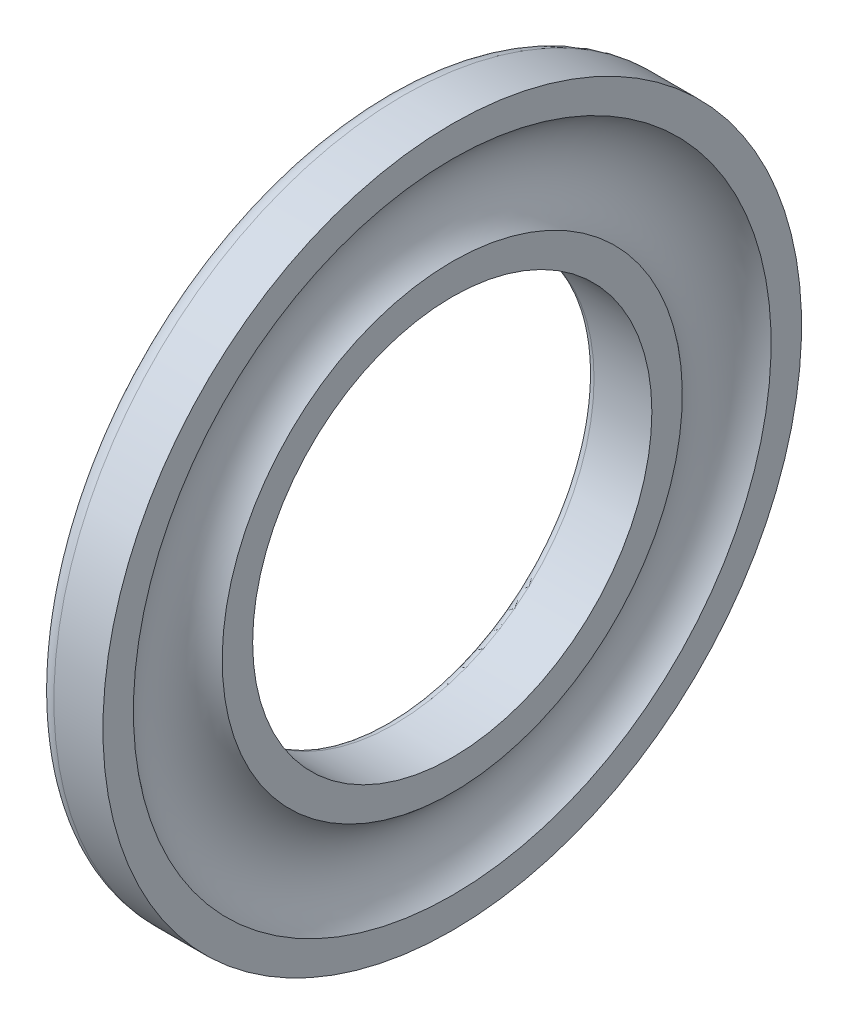
ISO-10303-21;
HEADER;
FILE_DESCRIPTION(('STEP AP214'),'2;1');
FILE_NAME('part.step','',(''),(''),'','','');
FILE_SCHEMA(('AUTOMOTIVE_DESIGN { 1 0 10303 214 1 1 1 1 }'));
ENDSEC;
DATA;
#1=APPLICATION_CONTEXT('core data for automotive mechanical design processes');
#2=APPLICATION_PROTOCOL_DEFINITION('international standard','automotive_design',2000,#1);
#3=PRODUCT_CONTEXT('',#1,'mechanical');
#4=PRODUCT('Part','Part','',(#3));
#5=PRODUCT_RELATED_PRODUCT_CATEGORY('part','',(#4));
#6=PRODUCT_DEFINITION_FORMATION('','',#4);
#7=PRODUCT_DEFINITION_CONTEXT('part definition',#1,'design');
#8=PRODUCT_DEFINITION('design','',#6,#7);
#9=PRODUCT_DEFINITION_SHAPE('','',#8);
#10=(LENGTH_UNIT() NAMED_UNIT(*) SI_UNIT(.MILLI.,.METRE.));
#11=(NAMED_UNIT(*) PLANE_ANGLE_UNIT() SI_UNIT($,.RADIAN.));
#12=(NAMED_UNIT(*) SI_UNIT($,.STERADIAN.) SOLID_ANGLE_UNIT());
#13=UNCERTAINTY_MEASURE_WITH_UNIT(LENGTH_MEASURE(1.E-05),#10,'distance_accuracy_value','');
#14=(GEOMETRIC_REPRESENTATION_CONTEXT(3) GLOBAL_UNCERTAINTY_ASSIGNED_CONTEXT((#13)) GLOBAL_UNIT_ASSIGNED_CONTEXT((#10,
#11,#12)) REPRESENTATION_CONTEXT('',''));
#15=CARTESIAN_POINT('',(0.,0.,0.));
#16=DIRECTION('',(0.,0.,1.));
#17=DIRECTION('',(1.,0.,0.));
#18=AXIS2_PLACEMENT_3D('',#15,#16,#17);
#19=CARTESIAN_POINT('',(0.875,0.,0.));
#20=DIRECTION('',(1.,0.,0.));
#21=DIRECTION('',(0.,0.,1.));
#22=AXIS2_PLACEMENT_3D('',#19,#20,#21);
#23=TOROIDAL_SURFACE('',#22,16.625,0.875);
#24=CARTESIAN_POINT('',(0.,0.,0.));
#25=DIRECTION('',(1.,0.,0.));
#26=DIRECTION('',(0.,1.,0.));
#27=AXIS2_PLACEMENT_3D('',#24,#25,#26);
#28=CIRCLE('',#27,16.625);
#29=CARTESIAN_POINT('',(0.,16.625,0.));
#30=VERTEX_POINT('',#29);
#31=EDGE_CURVE('E11',#30,#30,#28,.T.);
#32=ORIENTED_EDGE('',*,*,#31,.T.);
#33=EDGE_LOOP('',(#32));
#34=FACE_BOUND('',#33,.T.);
#35=CARTESIAN_POINT('',(0.875,0.,0.));
#36=DIRECTION('',(1.,0.,0.));
#37=DIRECTION('',(0.,1.,0.));
#38=AXIS2_PLACEMENT_3D('',#35,#36,#37);
#39=CIRCLE('',#38,17.5);
#40=CARTESIAN_POINT('',(0.875,17.5,0.));
#41=VERTEX_POINT('',#40);
#42=EDGE_CURVE('E57',#41,#41,#39,.T.);
#43=ORIENTED_EDGE('',*,*,#42,.F.);
#44=EDGE_LOOP('',(#43));
#45=FACE_BOUND('',#44,.T.);
#46=ADVANCED_FACE('F16',(#34,#45),#23,.T.);
#47=CARTESIAN_POINT('',(0.,13.53125,0.));
#48=DIRECTION('',(-1.,0.,0.));
#49=DIRECTION('',(0.,-1.,0.));
#50=AXIS2_PLACEMENT_3D('',#47,#48,#49);
#51=PLANE('',#50);
#52=CARTESIAN_POINT('',(0.,0.,0.));
#53=DIRECTION('',(1.,0.,0.));
#54=DIRECTION('',(0.,1.,0.));
#55=AXIS2_PLACEMENT_3D('',#52,#53,#54);
#56=CIRCLE('',#55,10.4375);
#57=CARTESIAN_POINT('',(0.,10.4375,0.));
#58=VERTEX_POINT('',#57);
#59=EDGE_CURVE('E24',#58,#58,#56,.T.);
#60=ORIENTED_EDGE('',*,*,#59,.T.);
#61=EDGE_LOOP('',(#60));
#62=FACE_BOUND('',#61,.T.);
#63=ORIENTED_EDGE('',*,*,#31,.F.);
#64=EDGE_LOOP('',(#63));
#65=FACE_BOUND('',#64,.T.);
#66=ADVANCED_FACE('F70',(#62,#65),#51,.T.);
#67=CARTESIAN_POINT('',(0.4375,0.,0.));
#68=DIRECTION('',(1.,0.,0.));
#69=DIRECTION('',(0.,0.,1.));
#70=AXIS2_PLACEMENT_3D('',#67,#68,#69);
#71=TOROIDAL_SURFACE('',#70,10.4375,0.4375);
#72=CARTESIAN_POINT('',(0.4375,0.,0.));
#73=DIRECTION('',(1.,0.,0.));
#74=DIRECTION('',(0.,1.,0.));
#75=AXIS2_PLACEMENT_3D('',#72,#73,#74);
#76=CIRCLE('',#75,10.);
#77=CARTESIAN_POINT('',(0.4375,10.,0.));
#78=VERTEX_POINT('',#77);
#79=EDGE_CURVE('E48',#78,#78,#76,.T.);
#80=ORIENTED_EDGE('',*,*,#79,.T.);
#81=EDGE_LOOP('',(#80));
#82=FACE_BOUND('',#81,.T.);
#83=ORIENTED_EDGE('',*,*,#59,.F.);
#84=EDGE_LOOP('',(#83));
#85=FACE_BOUND('',#84,.T.);
#86=ADVANCED_FACE('F49',(#82,#85),#71,.T.);
#87=CARTESIAN_POINT('',(1.88541666666666,0.,0.));
#88=DIRECTION('',(-1.,0.,0.));
#89=DIRECTION('',(0.,1.,0.));
#90=AXIS2_PLACEMENT_3D('',#87,#88,#89);
#91=CYLINDRICAL_SURFACE('',#90,10.);
#92=CARTESIAN_POINT('',(3.33333333333333,0.,0.));
#93=DIRECTION('',(1.,0.,0.));
#94=DIRECTION('',(0.,1.,0.));
#95=AXIS2_PLACEMENT_3D('',#92,#93,#94);
#96=CIRCLE('',#95,10.);
#97=CARTESIAN_POINT('',(3.33333333333333,10.,0.));
#98=VERTEX_POINT('',#97);
#99=EDGE_CURVE('E44',#98,#98,#96,.T.);
#100=ORIENTED_EDGE('',*,*,#99,.T.);
#101=EDGE_LOOP('',(#100));
#102=FACE_BOUND('',#101,.T.);
#103=ORIENTED_EDGE('',*,*,#79,.F.);
#104=EDGE_LOOP('',(#103));
#105=FACE_BOUND('',#104,.T.);
#106=ADVANCED_FACE('F79',(#102,#105),#91,.F.);
#107=CARTESIAN_POINT('',(3.33333333333333,10.7625003121099,0.));
#108=DIRECTION('',(1.,0.,0.));
#109=DIRECTION('',(0.,1.,0.));
#110=AXIS2_PLACEMENT_3D('',#107,#108,#109);
#111=PLANE('',#110);
#112=CARTESIAN_POINT('',(3.33333333333333,0.,0.));
#113=DIRECTION('',(1.,0.,0.));
#114=DIRECTION('',(0.,1.,0.));
#115=AXIS2_PLACEMENT_3D('',#112,#113,#114);
#116=CIRCLE('',#115,11.5250006242198);
#117=CARTESIAN_POINT('',(3.33333333333333,11.5250006242198,0.));
#118=VERTEX_POINT('',#117);
#119=EDGE_CURVE('E53',#118,#118,#116,.T.);
#120=ORIENTED_EDGE('',*,*,#119,.T.);
#121=EDGE_LOOP('',(#120));
#122=FACE_BOUND('',#121,.T.);
#123=ORIENTED_EDGE('',*,*,#99,.F.);
#124=EDGE_LOOP('',(#123));
#125=FACE_BOUND('',#124,.T.);
#126=ADVANCED_FACE('F85',(#122,#125),#111,.T.);
#127=CARTESIAN_POINT('',(5.,0.,0.));
#128=DIRECTION('',(1.,0.,0.));
#129=DIRECTION('',(0.,0.,1.));
#130=AXIS2_PLACEMENT_3D('',#127,#128,#129);
#131=TOROIDAL_SURFACE('',#130,13.75,2.78);
#132=CARTESIAN_POINT('',(3.33333333333333,0.,0.));
#133=DIRECTION('',(1.,0.,0.));
#134=DIRECTION('',(0.,1.,0.));
#135=AXIS2_PLACEMENT_3D('',#132,#133,#134);
#136=CIRCLE('',#135,15.9749993757802);
#137=CARTESIAN_POINT('',(3.33333333333333,15.9749993757802,0.));
#138=VERTEX_POINT('',#137);
#139=EDGE_CURVE('E59',#138,#138,#136,.T.);
#140=ORIENTED_EDGE('',*,*,#139,.T.);
#141=EDGE_LOOP('',(#140));
#142=FACE_BOUND('',#141,.T.);
#143=ORIENTED_EDGE('',*,*,#119,.F.);
#144=EDGE_LOOP('',(#143));
#145=FACE_BOUND('',#144,.T.);
#146=ADVANCED_FACE('F88',(#142,#145),#131,.F.);
#147=CARTESIAN_POINT('',(3.33333333333333,16.7374996878901,0.));
#148=DIRECTION('',(1.,0.,0.));
#149=DIRECTION('',(0.,1.,0.));
#150=AXIS2_PLACEMENT_3D('',#147,#148,#149);
#151=PLANE('',#150);
#152=CARTESIAN_POINT('',(3.33333333333333,0.,0.));
#153=DIRECTION('',(1.,0.,0.));
#154=DIRECTION('',(0.,1.,0.));
#155=AXIS2_PLACEMENT_3D('',#152,#153,#154);
#156=CIRCLE('',#155,17.5);
#157=CARTESIAN_POINT('',(3.33333333333333,17.5,0.));
#158=VERTEX_POINT('',#157);
#159=EDGE_CURVE('E56',#158,#158,#156,.T.);
#160=ORIENTED_EDGE('',*,*,#159,.T.);
#161=EDGE_LOOP('',(#160));
#162=FACE_BOUND('',#161,.T.);
#163=ORIENTED_EDGE('',*,*,#139,.F.);
#164=EDGE_LOOP('',(#163));
#165=FACE_BOUND('',#164,.T.);
#166=ADVANCED_FACE('F91',(#162,#165),#151,.T.);
#167=CARTESIAN_POINT('',(2.10416666666667,0.,0.));
#168=DIRECTION('',(-1.,0.,0.));
#169=DIRECTION('',(0.,1.,0.));
#170=AXIS2_PLACEMENT_3D('',#167,#168,#169);
#171=CYLINDRICAL_SURFACE('',#170,17.5);
#172=ORIENTED_EDGE('',*,*,#42,.T.);
#173=EDGE_LOOP('',(#172));
#174=FACE_BOUND('',#173,.T.);
#175=ORIENTED_EDGE('',*,*,#159,.F.);
#176=EDGE_LOOP('',(#175));
#177=FACE_BOUND('',#176,.T.);
#178=ADVANCED_FACE('F66',(#174,#177),#171,.T.);
#179=CLOSED_SHELL('',(#46,#66,#86,#106,#126,#146,#166,#178));
#180=MANIFOLD_SOLID_BREP('B1',#179);
#181=ADVANCED_BREP_SHAPE_REPRESENTATION('',(#18,#180),#14);
#182=SHAPE_DEFINITION_REPRESENTATION(#9,#181);
ENDSEC;
END-ISO-10303-21;
